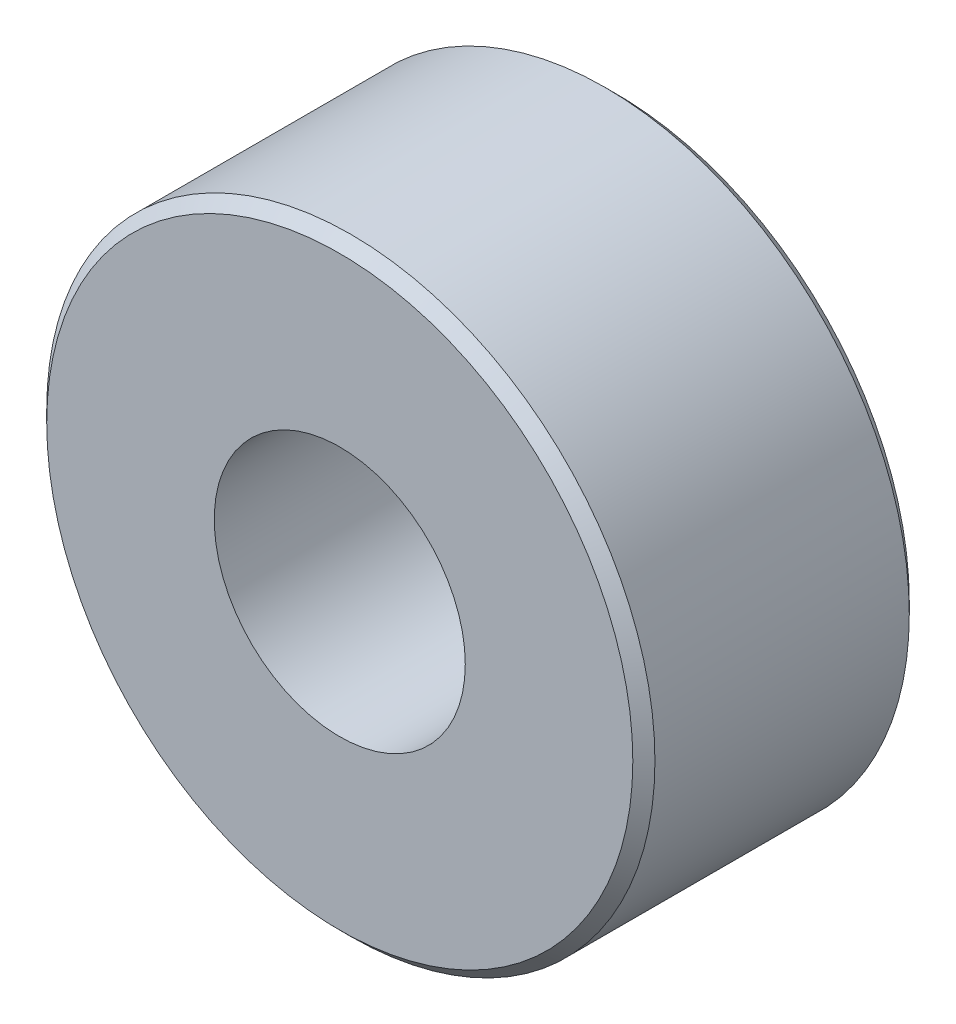
ISO-10303-21;
HEADER;
FILE_DESCRIPTION(('STEP AP214'),'2;1');
FILE_NAME('part.step','',(''),(''),'','','');
FILE_SCHEMA(('AUTOMOTIVE_DESIGN { 1 0 10303 214 1 1 1 1 }'));
ENDSEC;
DATA;
#1=APPLICATION_CONTEXT('core data for automotive mechanical design processes');
#2=APPLICATION_PROTOCOL_DEFINITION('international standard','automotive_design',2000,#1);
#3=PRODUCT_CONTEXT('',#1,'mechanical');
#4=PRODUCT('Part','Part','',(#3));
#5=PRODUCT_RELATED_PRODUCT_CATEGORY('part','',(#4));
#6=PRODUCT_DEFINITION_FORMATION('','',#4);
#7=PRODUCT_DEFINITION_CONTEXT('part definition',#1,'design');
#8=PRODUCT_DEFINITION('design','',#6,#7);
#9=PRODUCT_DEFINITION_SHAPE('','',#8);
#10=(LENGTH_UNIT() NAMED_UNIT(*) SI_UNIT(.MILLI.,.METRE.));
#11=(NAMED_UNIT(*) PLANE_ANGLE_UNIT() SI_UNIT($,.RADIAN.));
#12=(NAMED_UNIT(*) SI_UNIT($,.STERADIAN.) SOLID_ANGLE_UNIT());
#13=UNCERTAINTY_MEASURE_WITH_UNIT(LENGTH_MEASURE(1.E-05),#10,'distance_accuracy_value','');
#14=(GEOMETRIC_REPRESENTATION_CONTEXT(3) GLOBAL_UNCERTAINTY_ASSIGNED_CONTEXT((#13)) GLOBAL_UNIT_ASSIGNED_CONTEXT((#10,
#11,#12)) REPRESENTATION_CONTEXT('',''));
#15=CARTESIAN_POINT('',(0.,0.,0.));
#16=DIRECTION('',(0.,0.,1.));
#17=DIRECTION('',(1.,0.,0.));
#18=AXIS2_PLACEMENT_3D('',#15,#16,#17);
#19=CARTESIAN_POINT('',(0.,0.,12.5));
#20=DIRECTION('',(0.,0.,-1.));
#21=DIRECTION('',(-1.,0.,0.));
#22=AXIS2_PLACEMENT_3D('',#19,#20,#21);
#23=CYLINDRICAL_SURFACE('',#22,27.5);
#24=CARTESIAN_POINT('',(0.,0.,-11.5));
#25=DIRECTION('',(0.,0.,1.));
#26=DIRECTION('',(1.,0.,0.));
#27=AXIS2_PLACEMENT_3D('',#24,#25,#26);
#28=CIRCLE('',#27,27.5);
#29=CARTESIAN_POINT('',(27.5,0.,-11.5));
#30=VERTEX_POINT('',#29);
#31=EDGE_CURVE('E42',#30,#30,#28,.T.);
#32=ORIENTED_EDGE('',*,*,#31,.T.);
#33=EDGE_LOOP('',(#32));
#34=FACE_BOUND('',#33,.T.);
#35=CARTESIAN_POINT('',(0.,0.,11.5));
#36=DIRECTION('',(0.,0.,1.));
#37=DIRECTION('',(1.,0.,0.));
#38=AXIS2_PLACEMENT_3D('',#35,#36,#37);
#39=CIRCLE('',#38,27.5);
#40=CARTESIAN_POINT('',(27.5,0.,11.5));
#41=VERTEX_POINT('',#40);
#42=EDGE_CURVE('E46',#41,#41,#39,.F.);
#43=ORIENTED_EDGE('',*,*,#42,.T.);
#44=EDGE_LOOP('',(#43));
#45=FACE_BOUND('',#44,.T.);
#46=ADVANCED_FACE('F31',(#34,#45),#23,.T.);
#47=CARTESIAN_POINT('',(0.,0.,12.5));
#48=DIRECTION('',(0.,0.,1.));
#49=DIRECTION('',(1.,0.,0.));
#50=AXIS2_PLACEMENT_3D('',#47,#48,#49);
#51=PLANE('',#50);
#52=CARTESIAN_POINT('',(0.,0.,12.5));
#53=DIRECTION('',(0.,0.,1.));
#54=DIRECTION('',(1.,0.,0.));
#55=AXIS2_PLACEMENT_3D('',#52,#53,#54);
#56=CIRCLE('',#55,26.5);
#57=CARTESIAN_POINT('',(26.5,0.,12.5));
#58=VERTEX_POINT('',#57);
#59=EDGE_CURVE('E10',#58,#58,#56,.T.);
#60=ORIENTED_EDGE('',*,*,#59,.T.);
#61=EDGE_LOOP('',(#60));
#62=FACE_BOUND('',#61,.T.);
#63=CARTESIAN_POINT('',(0.,0.,12.5));
#64=DIRECTION('',(0.,0.,1.));
#65=DIRECTION('',(1.,0.,0.));
#66=AXIS2_PLACEMENT_3D('',#63,#64,#65);
#67=CIRCLE('',#66,11.35);
#68=CARTESIAN_POINT('',(11.35,0.,12.5));
#69=VERTEX_POINT('',#68);
#70=EDGE_CURVE('E54',#69,#69,#67,.T.);
#71=ORIENTED_EDGE('',*,*,#70,.F.);
#72=EDGE_LOOP('',(#71));
#73=FACE_BOUND('',#72,.T.);
#74=ADVANCED_FACE('F60',(#62,#73),#51,.T.);
#75=CARTESIAN_POINT('',(0.,0.,-12.5));
#76=DIRECTION('',(0.,0.,1.));
#77=DIRECTION('',(1.,0.,0.));
#78=AXIS2_PLACEMENT_3D('',#75,#76,#77);
#79=PLANE('',#78);
#80=CARTESIAN_POINT('',(0.,0.,-12.5));
#81=DIRECTION('',(0.,0.,1.));
#82=DIRECTION('',(1.,0.,0.));
#83=AXIS2_PLACEMENT_3D('',#80,#81,#82);
#84=CIRCLE('',#83,26.5);
#85=CARTESIAN_POINT('',(26.5,0.,-12.5));
#86=VERTEX_POINT('',#85);
#87=EDGE_CURVE('E38',#86,#86,#84,.F.);
#88=ORIENTED_EDGE('',*,*,#87,.T.);
#89=EDGE_LOOP('',(#88));
#90=FACE_BOUND('',#89,.T.);
#91=CARTESIAN_POINT('',(0.,0.,-12.5));
#92=DIRECTION('',(0.,0.,1.));
#93=DIRECTION('',(1.,0.,0.));
#94=AXIS2_PLACEMENT_3D('',#91,#92,#93);
#95=CIRCLE('',#94,11.35);
#96=CARTESIAN_POINT('',(11.35,0.,-12.5));
#97=VERTEX_POINT('',#96);
#98=EDGE_CURVE('E51',#97,#97,#95,.T.);
#99=ORIENTED_EDGE('',*,*,#98,.T.);
#100=EDGE_LOOP('',(#99));
#101=FACE_BOUND('',#100,.T.);
#102=ADVANCED_FACE('F62',(#90,#101),#79,.F.);
#103=CARTESIAN_POINT('',(0.,0.,-12.5));
#104=DIRECTION('',(0.,0.,1.));
#105=DIRECTION('',(1.,0.,0.));
#106=AXIS2_PLACEMENT_3D('',#103,#104,#105);
#107=CYLINDRICAL_SURFACE('',#106,11.35);
#108=ORIENTED_EDGE('',*,*,#98,.F.);
#109=EDGE_LOOP('',(#108));
#110=FACE_BOUND('',#109,.T.);
#111=ORIENTED_EDGE('',*,*,#70,.T.);
#112=EDGE_LOOP('',(#111));
#113=FACE_BOUND('',#112,.T.);
#114=ADVANCED_FACE('F58',(#110,#113),#107,.F.);
#115=CARTESIAN_POINT('',(0.,0.,-11.5));
#116=DIRECTION('',(0.,0.,1.));
#117=DIRECTION('',(1.,0.,0.));
#118=AXIS2_PLACEMENT_3D('',#115,#116,#117);
#119=CONICAL_SURFACE('',#118,27.5,0.785398163397447);
#120=ORIENTED_EDGE('',*,*,#87,.F.);
#121=EDGE_LOOP('',(#120));
#122=FACE_BOUND('',#121,.T.);
#123=ORIENTED_EDGE('',*,*,#31,.F.);
#124=EDGE_LOOP('',(#123));
#125=FACE_BOUND('',#124,.T.);
#126=ADVANCED_FACE('F72',(#122,#125),#119,.T.);
#127=CARTESIAN_POINT('',(0.,0.,12.5));
#128=DIRECTION('',(0.,0.,-1.));
#129=DIRECTION('',(-1.,0.,0.));
#130=AXIS2_PLACEMENT_3D('',#127,#128,#129);
#131=CONICAL_SURFACE('',#130,26.5,0.785398163397447);
#132=ORIENTED_EDGE('',*,*,#42,.F.);
#133=EDGE_LOOP('',(#132));
#134=FACE_BOUND('',#133,.T.);
#135=ORIENTED_EDGE('',*,*,#59,.F.);
#136=EDGE_LOOP('',(#135));
#137=FACE_BOUND('',#136,.T.);
#138=ADVANCED_FACE('F33',(#134,#137),#131,.T.);
#139=CLOSED_SHELL('',(#46,#74,#102,#114,#126,#138));
#140=MANIFOLD_SOLID_BREP('B2',#139);
#141=ADVANCED_BREP_SHAPE_REPRESENTATION('',(#18,#140),#14);
#142=SHAPE_DEFINITION_REPRESENTATION(#9,#141);
ENDSEC;
END-ISO-10303-21;
